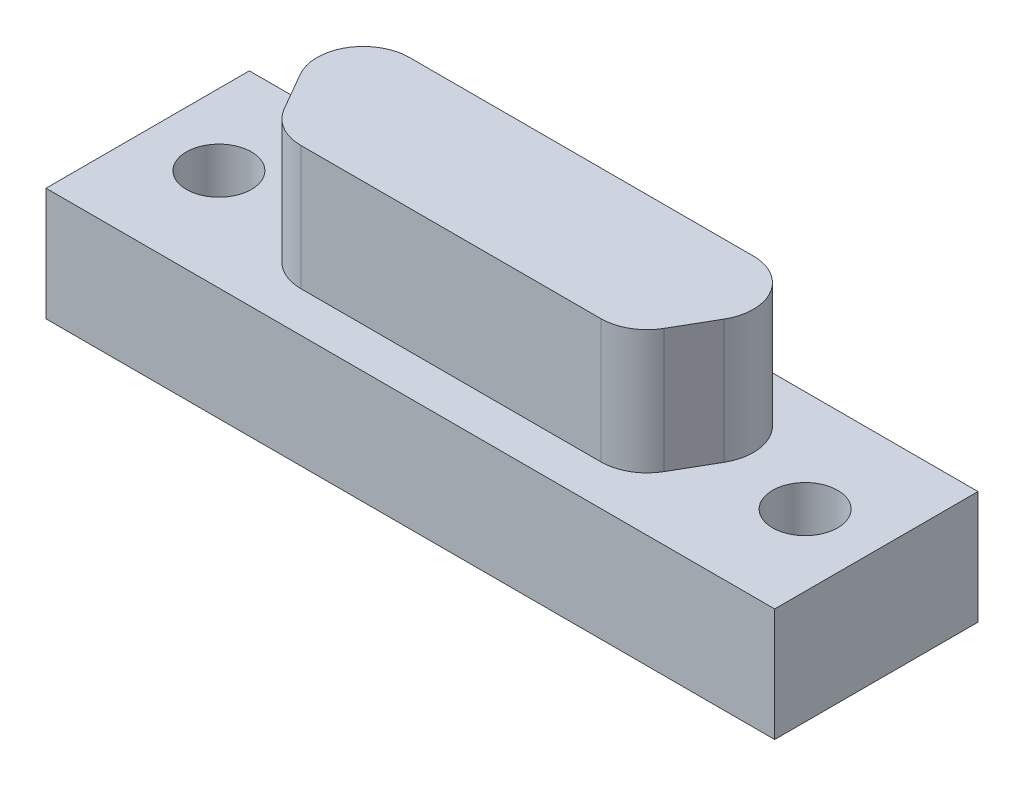
ISO-10303-21;
HEADER;
FILE_DESCRIPTION(('STEP AP214'),'2;1');
FILE_NAME('part.step','',(''),(''),'','','');
FILE_SCHEMA(('AUTOMOTIVE_DESIGN { 1 0 10303 214 1 1 1 1 }'));
ENDSEC;
DATA;
#1=APPLICATION_CONTEXT('core data for automotive mechanical design processes');
#2=APPLICATION_PROTOCOL_DEFINITION('international standard','automotive_design',2000,#1);
#3=PRODUCT_CONTEXT('',#1,'mechanical');
#4=PRODUCT('Part','Part','',(#3));
#5=PRODUCT_RELATED_PRODUCT_CATEGORY('part','',(#4));
#6=PRODUCT_DEFINITION_FORMATION('','',#4);
#7=PRODUCT_DEFINITION_CONTEXT('part definition',#1,'design');
#8=PRODUCT_DEFINITION('design','',#6,#7);
#9=PRODUCT_DEFINITION_SHAPE('','',#8);
#10=(LENGTH_UNIT() NAMED_UNIT(*) SI_UNIT(.MILLI.,.METRE.));
#11=(NAMED_UNIT(*) PLANE_ANGLE_UNIT() SI_UNIT($,.RADIAN.));
#12=(NAMED_UNIT(*) SI_UNIT($,.STERADIAN.) SOLID_ANGLE_UNIT());
#13=UNCERTAINTY_MEASURE_WITH_UNIT(LENGTH_MEASURE(1.E-05),#10,'distance_accuracy_value','');
#14=(GEOMETRIC_REPRESENTATION_CONTEXT(3) GLOBAL_UNCERTAINTY_ASSIGNED_CONTEXT((#13)) GLOBAL_UNIT_ASSIGNED_CONTEXT((#10,
#11,#12)) REPRESENTATION_CONTEXT('',''));
#15=CARTESIAN_POINT('',(0.,0.,0.));
#16=DIRECTION('',(0.,0.,1.));
#17=DIRECTION('',(1.,0.,0.));
#18=AXIS2_PLACEMENT_3D('',#15,#16,#17);
#19=CARTESIAN_POINT('',(27.31,4.24,0.));
#20=DIRECTION('',(1.,0.,0.));
#21=DIRECTION('',(0.,0.,-1.));
#22=AXIS2_PLACEMENT_3D('',#19,#20,#21);
#23=PLANE('',#22);
#24=DIRECTION('',(0.,0.,1.));
#25=VECTOR('',#24,1.);
#26=CARTESIAN_POINT('',(27.31,0.,0.));
#27=LINE('',#26,#25);
#28=CARTESIAN_POINT('',(27.31,0.,0.));
#29=VERTEX_POINT('',#28);
#30=CARTESIAN_POINT('',(27.31,0.,7.62));
#31=VERTEX_POINT('',#30);
#32=EDGE_CURVE('E122',#29,#31,#27,.T.);
#33=ORIENTED_EDGE('',*,*,#32,.F.);
#34=DIRECTION('',(0.,-1.,0.));
#35=VECTOR('',#34,1.);
#36=CARTESIAN_POINT('',(27.31,4.24,0.));
#37=LINE('',#36,#35);
#38=CARTESIAN_POINT('',(27.31,4.24,0.));
#39=VERTEX_POINT('',#38);
#40=EDGE_CURVE('E11',#39,#29,#37,.T.);
#41=ORIENTED_EDGE('',*,*,#40,.F.);
#42=DIRECTION('',(0.,0.,1.));
#43=VECTOR('',#42,1.);
#44=CARTESIAN_POINT('',(27.31,4.24,0.));
#45=LINE('',#44,#43);
#46=CARTESIAN_POINT('',(27.31,4.24,7.62));
#47=VERTEX_POINT('',#46);
#48=EDGE_CURVE('E108',#39,#47,#45,.T.);
#49=ORIENTED_EDGE('',*,*,#48,.T.);
#50=DIRECTION('',(0.,-1.,0.));
#51=VECTOR('',#50,1.);
#52=CARTESIAN_POINT('',(27.31,4.24,7.62));
#53=LINE('',#52,#51);
#54=EDGE_CURVE('E76',#47,#31,#53,.T.);
#55=ORIENTED_EDGE('',*,*,#54,.T.);
#56=EDGE_LOOP('',(#33,#41,#49,#55));
#57=FACE_BOUND('',#56,.T.);
#58=ADVANCED_FACE('F35',(#57),#23,.T.);
#59=CARTESIAN_POINT('',(0.,4.24,0.));
#60=DIRECTION('',(0.,0.,-1.));
#61=DIRECTION('',(-1.,0.,0.));
#62=AXIS2_PLACEMENT_3D('',#59,#60,#61);
#63=PLANE('',#62);
#64=DIRECTION('',(1.,0.,0.));
#65=VECTOR('',#64,1.);
#66=CARTESIAN_POINT('',(0.,0.,0.));
#67=LINE('',#66,#65);
#68=CARTESIAN_POINT('',(0.,0.,0.));
#69=VERTEX_POINT('',#68);
#70=EDGE_CURVE('E99',#69,#29,#67,.T.);
#71=ORIENTED_EDGE('',*,*,#70,.F.);
#72=DIRECTION('',(0.,-1.,0.));
#73=VECTOR('',#72,1.);
#74=CARTESIAN_POINT('',(0.,4.24,0.));
#75=LINE('',#74,#73);
#76=CARTESIAN_POINT('',(0.,4.24,0.));
#77=VERTEX_POINT('',#76);
#78=EDGE_CURVE('E44',#77,#69,#75,.T.);
#79=ORIENTED_EDGE('',*,*,#78,.F.);
#80=DIRECTION('',(1.,0.,0.));
#81=VECTOR('',#80,1.);
#82=CARTESIAN_POINT('',(0.,4.24,0.));
#83=LINE('',#82,#81);
#84=EDGE_CURVE('E97',#77,#39,#83,.T.);
#85=ORIENTED_EDGE('',*,*,#84,.T.);
#86=ORIENTED_EDGE('',*,*,#40,.T.);
#87=EDGE_LOOP('',(#71,#79,#85,#86));
#88=FACE_BOUND('',#87,.T.);
#89=ADVANCED_FACE('F95',(#88),#63,.T.);
#90=CARTESIAN_POINT('',(0.,4.24,0.));
#91=DIRECTION('',(1.,0.,0.));
#92=DIRECTION('',(0.,0.,-1.));
#93=AXIS2_PLACEMENT_3D('',#90,#91,#92);
#94=PLANE('',#93);
#95=DIRECTION('',(0.,0.,1.));
#96=VECTOR('',#95,1.);
#97=CARTESIAN_POINT('',(0.,0.,0.));
#98=LINE('',#97,#96);
#99=CARTESIAN_POINT('',(0.,0.,7.62));
#100=VERTEX_POINT('',#99);
#101=EDGE_CURVE('E125',#69,#100,#98,.T.);
#102=ORIENTED_EDGE('',*,*,#101,.T.);
#103=DIRECTION('',(0.,-1.,0.));
#104=VECTOR('',#103,1.);
#105=CARTESIAN_POINT('',(0.,4.24,7.62));
#106=LINE('',#105,#104);
#107=CARTESIAN_POINT('',(0.,4.24,7.62));
#108=VERTEX_POINT('',#107);
#109=EDGE_CURVE('E102',#108,#100,#106,.T.);
#110=ORIENTED_EDGE('',*,*,#109,.F.);
#111=DIRECTION('',(0.,0.,1.));
#112=VECTOR('',#111,1.);
#113=CARTESIAN_POINT('',(0.,4.24,0.));
#114=LINE('',#113,#112);
#115=EDGE_CURVE('E104',#77,#108,#114,.T.);
#116=ORIENTED_EDGE('',*,*,#115,.F.);
#117=ORIENTED_EDGE('',*,*,#78,.T.);
#118=EDGE_LOOP('',(#102,#110,#116,#117));
#119=FACE_BOUND('',#118,.T.);
#120=ADVANCED_FACE('F105',(#119),#94,.F.);
#121=CARTESIAN_POINT('',(2.67,4.24,3.81));
#122=DIRECTION('',(0.,-1.,0.));
#123=DIRECTION('',(0.,0.,-1.));
#124=AXIS2_PLACEMENT_3D('',#121,#122,#123);
#125=CYLINDRICAL_SURFACE('',#124,1.22);
#126=CARTESIAN_POINT('',(2.67,4.24,3.81));
#127=DIRECTION('',(0.,1.,0.));
#128=DIRECTION('',(0.,0.,1.));
#129=AXIS2_PLACEMENT_3D('',#126,#127,#128);
#130=CIRCLE('',#129,1.22);
#131=CARTESIAN_POINT('',(2.67,4.24,5.03));
#132=VERTEX_POINT('',#131);
#133=EDGE_CURVE('E110',#132,#132,#130,.T.);
#134=ORIENTED_EDGE('',*,*,#133,.T.);
#135=EDGE_LOOP('',(#134));
#136=FACE_BOUND('',#135,.T.);
#137=CARTESIAN_POINT('',(2.67,0.,3.81));
#138=DIRECTION('',(0.,1.,0.));
#139=DIRECTION('',(0.,0.,1.));
#140=AXIS2_PLACEMENT_3D('',#137,#138,#139);
#141=CIRCLE('',#140,1.22);
#142=CARTESIAN_POINT('',(2.67,0.,5.03));
#143=VERTEX_POINT('',#142);
#144=EDGE_CURVE('E118',#143,#143,#141,.T.);
#145=ORIENTED_EDGE('',*,*,#144,.F.);
#146=EDGE_LOOP('',(#145));
#147=FACE_BOUND('',#146,.T.);
#148=ADVANCED_FACE('F140',(#136,#147),#125,.F.);
#149=CARTESIAN_POINT('',(24.64,4.24,3.81));
#150=DIRECTION('',(0.,-1.,0.));
#151=DIRECTION('',(0.,0.,-1.));
#152=AXIS2_PLACEMENT_3D('',#149,#150,#151);
#153=CYLINDRICAL_SURFACE('',#152,1.22);
#154=CARTESIAN_POINT('',(24.64,4.24,3.81));
#155=DIRECTION('',(0.,1.,0.));
#156=DIRECTION('',(0.,0.,1.));
#157=AXIS2_PLACEMENT_3D('',#154,#155,#156);
#158=CIRCLE('',#157,1.22);
#159=CARTESIAN_POINT('',(24.64,4.24,5.03));
#160=VERTEX_POINT('',#159);
#161=EDGE_CURVE('E364',#160,#160,#158,.T.);
#162=ORIENTED_EDGE('',*,*,#161,.T.);
#163=EDGE_LOOP('',(#162));
#164=FACE_BOUND('',#163,.T.);
#165=CARTESIAN_POINT('',(24.64,0.,3.81));
#166=DIRECTION('',(0.,1.,0.));
#167=DIRECTION('',(0.,0.,1.));
#168=AXIS2_PLACEMENT_3D('',#165,#166,#167);
#169=CIRCLE('',#168,1.22);
#170=CARTESIAN_POINT('',(24.64,0.,5.03));
#171=VERTEX_POINT('',#170);
#172=EDGE_CURVE('E115',#171,#171,#169,.T.);
#173=ORIENTED_EDGE('',*,*,#172,.F.);
#174=EDGE_LOOP('',(#173));
#175=FACE_BOUND('',#174,.T.);
#176=ADVANCED_FACE('F37',(#164,#175),#153,.F.);
#177=CARTESIAN_POINT('',(0.,4.24,7.62));
#178=DIRECTION('',(0.,0.,-1.));
#179=DIRECTION('',(-1.,0.,0.));
#180=AXIS2_PLACEMENT_3D('',#177,#178,#179);
#181=PLANE('',#180);
#182=DIRECTION('',(1.,0.,0.));
#183=VECTOR('',#182,1.);
#184=CARTESIAN_POINT('',(0.,0.,7.62));
#185=LINE('',#184,#183);
#186=EDGE_CURVE('E69',#100,#31,#185,.T.);
#187=ORIENTED_EDGE('',*,*,#186,.T.);
#188=ORIENTED_EDGE('',*,*,#54,.F.);
#189=DIRECTION('',(1.,0.,0.));
#190=VECTOR('',#189,1.);
#191=CARTESIAN_POINT('',(0.,4.24,7.62));
#192=LINE('',#191,#190);
#193=EDGE_CURVE('E52',#108,#47,#192,.T.);
#194=ORIENTED_EDGE('',*,*,#193,.F.);
#195=ORIENTED_EDGE('',*,*,#109,.T.);
#196=EDGE_LOOP('',(#187,#188,#194,#195));
#197=FACE_BOUND('',#196,.T.);
#198=ADVANCED_FACE('F131',(#197),#181,.F.);
#199=CARTESIAN_POINT('',(0.,4.24,0.));
#200=DIRECTION('',(0.,1.,0.));
#201=DIRECTION('',(0.,0.,1.));
#202=AXIS2_PLACEMENT_3D('',#199,#200,#201);
#203=PLANE('',#202);
#204=CARTESIAN_POINT('',(20.105868875419,4.24,2.945));
#205=DIRECTION('',(0.,1.,0.));
#206=DIRECTION('',(0.,0.,1.));
#207=AXIS2_PLACEMENT_3D('',#204,#205,#206);
#208=CIRCLE('',#207,1.73);
#209=CARTESIAN_POINT('',(20.105868875419,4.24,1.215));
#210=VERTEX_POINT('',#209);
#211=CARTESIAN_POINT('',(21.6040928239661,4.24,3.81));
#212=VERTEX_POINT('',#211);
#213=EDGE_CURVE('E358',#210,#212,#208,.F.);
#214=ORIENTED_EDGE('',*,*,#213,.T.);
#215=DIRECTION('',(-0.5,0.,0.866025403784439));
#216=VECTOR('',#215,1.);
#217=CARTESIAN_POINT('',(17.8528480121839,4.24,10.3073466056359));
#218=LINE('',#217,#216);
#219=CARTESIAN_POINT('',(20.7784819390249,4.24,5.24));
#220=VERTEX_POINT('',#219);
#221=EDGE_CURVE('E361',#212,#220,#218,.T.);
#222=ORIENTED_EDGE('',*,*,#221,.T.);
#223=CARTESIAN_POINT('',(19.2802579904778,4.24,4.37499999999999));
#224=DIRECTION('',(0.,1.,0.));
#225=DIRECTION('',(0.,0.,1.));
#226=AXIS2_PLACEMENT_3D('',#223,#224,#225);
#227=CIRCLE('',#226,1.73000000000001);
#228=CARTESIAN_POINT('',(19.2802579904779,4.24,6.105));
#229=VERTEX_POINT('',#228);
#230=EDGE_CURVE('E128',#220,#229,#227,.F.);
#231=ORIENTED_EDGE('',*,*,#230,.T.);
#232=DIRECTION('',(1.,0.,0.));
#233=VECTOR('',#232,1.);
#234=CARTESIAN_POINT('',(0.,4.24,6.105));
#235=LINE('',#234,#233);
#236=CARTESIAN_POINT('',(8.0414797603602,4.24,6.105));
#237=VERTEX_POINT('',#236);
#238=EDGE_CURVE('E343',#237,#229,#235,.T.);
#239=ORIENTED_EDGE('',*,*,#238,.F.);
#240=CARTESIAN_POINT('',(8.0414797603602,4.24,4.37500000000001));
#241=DIRECTION('',(0.,1.,0.));
#242=DIRECTION('',(0.,0.,1.));
#243=AXIS2_PLACEMENT_3D('',#240,#241,#242);
#244=CIRCLE('',#243,1.72999999999999);
#245=CARTESIAN_POINT('',(6.54325581181313,4.24,5.24000000000001));
#246=VERTEX_POINT('',#245);
#247=EDGE_CURVE('E349',#237,#246,#244,.F.);
#248=ORIENTED_EDGE('',*,*,#247,.T.);
#249=DIRECTION('',(-0.5,0.,-0.866025403784439));
#250=VECTOR('',#249,1.);
#251=CARTESIAN_POINT('',(2.63845530094461,4.24,-1.52331287824517));
#252=LINE('',#251,#250);
#253=CARTESIAN_POINT('',(5.71764492687196,4.24,3.81));
#254=VERTEX_POINT('',#253);
#255=EDGE_CURVE('E352',#246,#254,#252,.T.);
#256=ORIENTED_EDGE('',*,*,#255,.T.);
#257=CARTESIAN_POINT('',(7.21586887541901,4.24,2.94500000000001));
#258=DIRECTION('',(0.,1.,0.));
#259=DIRECTION('',(0.,0.,1.));
#260=AXIS2_PLACEMENT_3D('',#257,#258,#259);
#261=CIRCLE('',#260,1.72999999999997);
#262=CARTESIAN_POINT('',(7.21586887541904,4.24,1.215));
#263=VERTEX_POINT('',#262);
#264=EDGE_CURVE('E355',#254,#263,#261,.F.);
#265=ORIENTED_EDGE('',*,*,#264,.T.);
#266=DIRECTION('',(-1.,0.,0.));
#267=VECTOR('',#266,1.);
#268=CARTESIAN_POINT('',(0.,4.24,1.215));
#269=LINE('',#268,#267);
#270=EDGE_CURVE('E119',#210,#263,#269,.T.);
#271=ORIENTED_EDGE('',*,*,#270,.F.);
#272=EDGE_LOOP('',(#214,#222,#231,#239,#248,#256,#265,#271));
#273=FACE_BOUND('',#272,.T.);
#274=ORIENTED_EDGE('',*,*,#161,.F.);
#275=EDGE_LOOP('',(#274));
#276=FACE_BOUND('',#275,.T.);
#277=ORIENTED_EDGE('',*,*,#133,.F.);
#278=EDGE_LOOP('',(#277));
#279=FACE_BOUND('',#278,.T.);
#280=ORIENTED_EDGE('',*,*,#48,.F.);
#281=ORIENTED_EDGE('',*,*,#84,.F.);
#282=ORIENTED_EDGE('',*,*,#115,.T.);
#283=ORIENTED_EDGE('',*,*,#193,.T.);
#284=EDGE_LOOP('',(#280,#281,#282,#283));
#285=FACE_BOUND('',#284,.T.);
#286=ADVANCED_FACE('F107',(#273,#276,#279,#285),#203,.T.);
#287=CARTESIAN_POINT('',(0.,0.,0.));
#288=DIRECTION('',(0.,1.,0.));
#289=DIRECTION('',(0.,0.,1.));
#290=AXIS2_PLACEMENT_3D('',#287,#288,#289);
#291=PLANE('',#290);
#292=ORIENTED_EDGE('',*,*,#172,.T.);
#293=EDGE_LOOP('',(#292));
#294=FACE_BOUND('',#293,.T.);
#295=ORIENTED_EDGE('',*,*,#144,.T.);
#296=EDGE_LOOP('',(#295));
#297=FACE_BOUND('',#296,.T.);
#298=ORIENTED_EDGE('',*,*,#32,.T.);
#299=ORIENTED_EDGE('',*,*,#186,.F.);
#300=ORIENTED_EDGE('',*,*,#101,.F.);
#301=ORIENTED_EDGE('',*,*,#70,.T.);
#302=EDGE_LOOP('',(#298,#299,#300,#301));
#303=FACE_BOUND('',#302,.T.);
#304=ADVANCED_FACE('F132',(#294,#297,#303),#291,.F.);
#305=CARTESIAN_POINT('',(20.105868875419,8.89,2.945));
#306=DIRECTION('',(0.,-1.,0.));
#307=DIRECTION('',(0.,0.,-1.));
#308=AXIS2_PLACEMENT_3D('',#305,#306,#307);
#309=CYLINDRICAL_SURFACE('',#308,1.73);
#310=DIRECTION('',(0.,-1.,0.));
#311=VECTOR('',#310,1.);
#312=CARTESIAN_POINT('',(21.6040928239661,8.89,3.81));
#313=LINE('',#312,#311);
#314=CARTESIAN_POINT('',(21.6040928239661,8.89,3.81));
#315=VERTEX_POINT('',#314);
#316=EDGE_CURVE('E326',#315,#212,#313,.T.);
#317=ORIENTED_EDGE('',*,*,#316,.T.);
#318=ORIENTED_EDGE('',*,*,#213,.F.);
#319=DIRECTION('',(0.,-1.,0.));
#320=VECTOR('',#319,1.);
#321=CARTESIAN_POINT('',(20.105868875419,8.89,1.215));
#322=LINE('',#321,#320);
#323=CARTESIAN_POINT('',(20.105868875419,8.89,1.215));
#324=VERTEX_POINT('',#323);
#325=EDGE_CURVE('E305',#324,#210,#322,.T.);
#326=ORIENTED_EDGE('',*,*,#325,.F.);
#327=CARTESIAN_POINT('',(20.105868875419,8.89,2.945));
#328=DIRECTION('',(0.,1.,0.));
#329=DIRECTION('',(0.,0.,1.));
#330=AXIS2_PLACEMENT_3D('',#327,#328,#329);
#331=CIRCLE('',#330,1.73);
#332=EDGE_CURVE('E289',#324,#315,#331,.F.);
#333=ORIENTED_EDGE('',*,*,#332,.T.);
#334=EDGE_LOOP('',(#317,#318,#326,#333));
#335=FACE_BOUND('',#334,.T.);
#336=ADVANCED_FACE('F154',(#335),#309,.T.);
#337=CARTESIAN_POINT('',(0.,8.89,1.215));
#338=DIRECTION('',(0.,0.,-1.));
#339=DIRECTION('',(-1.,0.,0.));
#340=AXIS2_PLACEMENT_3D('',#337,#338,#339);
#341=PLANE('',#340);
#342=ORIENTED_EDGE('',*,*,#325,.T.);
#343=ORIENTED_EDGE('',*,*,#270,.T.);
#344=DIRECTION('',(0.,-1.,0.));
#345=VECTOR('',#344,1.);
#346=CARTESIAN_POINT('',(7.21586887541904,8.89,1.215));
#347=LINE('',#346,#345);
#348=CARTESIAN_POINT('',(7.21586887541904,8.89,1.215));
#349=VERTEX_POINT('',#348);
#350=EDGE_CURVE('E308',#349,#263,#347,.T.);
#351=ORIENTED_EDGE('',*,*,#350,.F.);
#352=DIRECTION('',(1.,0.,0.));
#353=VECTOR('',#352,1.);
#354=CARTESIAN_POINT('',(0.,8.89,1.215));
#355=LINE('',#354,#353);
#356=EDGE_CURVE('E293',#349,#324,#355,.T.);
#357=ORIENTED_EDGE('',*,*,#356,.T.);
#358=EDGE_LOOP('',(#342,#343,#351,#357));
#359=FACE_BOUND('',#358,.T.);
#360=ADVANCED_FACE('F161',(#359),#341,.T.);
#361=CARTESIAN_POINT('',(7.21586887541904,8.89,2.94500000000001));
#362=DIRECTION('',(0.,-1.,0.));
#363=DIRECTION('',(0.,0.,-1.));
#364=AXIS2_PLACEMENT_3D('',#361,#362,#363);
#365=CYLINDRICAL_SURFACE('',#364,1.73);
#366=ORIENTED_EDGE('',*,*,#350,.T.);
#367=ORIENTED_EDGE('',*,*,#264,.F.);
#368=DIRECTION('',(0.,-1.,0.));
#369=VECTOR('',#368,1.);
#370=CARTESIAN_POINT('',(5.71764492687196,8.89,3.81));
#371=LINE('',#370,#369);
#372=CARTESIAN_POINT('',(5.71764492687196,8.89,3.81));
#373=VERTEX_POINT('',#372);
#374=EDGE_CURVE('E338',#373,#254,#371,.T.);
#375=ORIENTED_EDGE('',*,*,#374,.F.);
#376=CARTESIAN_POINT('',(7.21586887541904,8.89,2.94500000000001));
#377=DIRECTION('',(0.,1.,0.));
#378=DIRECTION('',(0.,0.,1.));
#379=AXIS2_PLACEMENT_3D('',#376,#377,#378);
#380=CIRCLE('',#379,1.73);
#381=EDGE_CURVE('E309',#373,#349,#380,.F.);
#382=ORIENTED_EDGE('',*,*,#381,.T.);
#383=EDGE_LOOP('',(#366,#367,#375,#382));
#384=FACE_BOUND('',#383,.T.);
#385=ADVANCED_FACE('F198',(#384),#365,.T.);
#386=CARTESIAN_POINT('',(2.63845530094461,8.89,-1.52331287824517));
#387=DIRECTION('',(-0.866025403784439,0.,0.5));
#388=DIRECTION('',(0.5,0.,0.866025403784439));
#389=AXIS2_PLACEMENT_3D('',#386,#387,#388);
#390=PLANE('',#389);
#391=ORIENTED_EDGE('',*,*,#374,.T.);
#392=ORIENTED_EDGE('',*,*,#255,.F.);
#393=DIRECTION('',(0.,-1.,0.));
#394=VECTOR('',#393,1.);
#395=CARTESIAN_POINT('',(6.54325581181313,8.89,5.24000000000001));
#396=LINE('',#395,#394);
#397=CARTESIAN_POINT('',(6.54325581181313,8.89,5.24000000000001));
#398=VERTEX_POINT('',#397);
#399=EDGE_CURVE('E335',#398,#246,#396,.T.);
#400=ORIENTED_EDGE('',*,*,#399,.F.);
#401=DIRECTION('',(-0.5,0.,-0.866025403784439));
#402=VECTOR('',#401,1.);
#403=CARTESIAN_POINT('',(2.63845530094461,8.89,-1.52331287824517));
#404=LINE('',#403,#402);
#405=EDGE_CURVE('E311',#398,#373,#404,.T.);
#406=ORIENTED_EDGE('',*,*,#405,.T.);
#407=EDGE_LOOP('',(#391,#392,#400,#406));
#408=FACE_BOUND('',#407,.T.);
#409=ADVANCED_FACE('F209',(#408),#390,.T.);
#410=CARTESIAN_POINT('',(8.0414797603602,8.89,4.37500000000001));
#411=DIRECTION('',(0.,-1.,0.));
#412=DIRECTION('',(0.,0.,-1.));
#413=AXIS2_PLACEMENT_3D('',#410,#411,#412);
#414=CYLINDRICAL_SURFACE('',#413,1.72999999999999);
#415=ORIENTED_EDGE('',*,*,#399,.T.);
#416=ORIENTED_EDGE('',*,*,#247,.F.);
#417=DIRECTION('',(0.,-1.,0.));
#418=VECTOR('',#417,1.);
#419=CARTESIAN_POINT('',(8.0414797603602,8.89,6.105));
#420=LINE('',#419,#418);
#421=CARTESIAN_POINT('',(8.0414797603602,8.89,6.105));
#422=VERTEX_POINT('',#421);
#423=EDGE_CURVE('E332',#422,#237,#420,.T.);
#424=ORIENTED_EDGE('',*,*,#423,.F.);
#425=CARTESIAN_POINT('',(8.0414797603602,8.89,4.37500000000001));
#426=DIRECTION('',(0.,1.,0.));
#427=DIRECTION('',(0.,0.,1.));
#428=AXIS2_PLACEMENT_3D('',#425,#426,#427);
#429=CIRCLE('',#428,1.72999999999999);
#430=EDGE_CURVE('E316',#422,#398,#429,.F.);
#431=ORIENTED_EDGE('',*,*,#430,.T.);
#432=EDGE_LOOP('',(#415,#416,#424,#431));
#433=FACE_BOUND('',#432,.T.);
#434=ADVANCED_FACE('F219',(#433),#414,.T.);
#435=CARTESIAN_POINT('',(0.,8.89,6.105));
#436=DIRECTION('',(0.,0.,1.));
#437=DIRECTION('',(1.,0.,0.));
#438=AXIS2_PLACEMENT_3D('',#435,#436,#437);
#439=PLANE('',#438);
#440=ORIENTED_EDGE('',*,*,#423,.T.);
#441=ORIENTED_EDGE('',*,*,#238,.T.);
#442=DIRECTION('',(0.,-1.,0.));
#443=VECTOR('',#442,1.);
#444=CARTESIAN_POINT('',(19.2802579904779,8.89,6.105));
#445=LINE('',#444,#443);
#446=CARTESIAN_POINT('',(19.2802579904779,8.89,6.105));
#447=VERTEX_POINT('',#446);
#448=EDGE_CURVE('E329',#447,#229,#445,.T.);
#449=ORIENTED_EDGE('',*,*,#448,.F.);
#450=DIRECTION('',(-1.,0.,0.));
#451=VECTOR('',#450,1.);
#452=CARTESIAN_POINT('',(0.,8.89,6.105));
#453=LINE('',#452,#451);
#454=EDGE_CURVE('E319',#447,#422,#453,.T.);
#455=ORIENTED_EDGE('',*,*,#454,.T.);
#456=EDGE_LOOP('',(#440,#441,#449,#455));
#457=FACE_BOUND('',#456,.T.);
#458=ADVANCED_FACE('F229',(#457),#439,.T.);
#459=CARTESIAN_POINT('',(19.2802579904778,8.89,4.37499999999999));
#460=DIRECTION('',(0.,-1.,0.));
#461=DIRECTION('',(0.,0.,-1.));
#462=AXIS2_PLACEMENT_3D('',#459,#460,#461);
#463=CYLINDRICAL_SURFACE('',#462,1.73000000000001);
#464=ORIENTED_EDGE('',*,*,#448,.T.);
#465=ORIENTED_EDGE('',*,*,#230,.F.);
#466=DIRECTION('',(0.,-1.,0.));
#467=VECTOR('',#466,1.);
#468=CARTESIAN_POINT('',(20.7784819390249,8.89,5.24));
#469=LINE('',#468,#467);
#470=CARTESIAN_POINT('',(20.7784819390249,8.89,5.24));
#471=VERTEX_POINT('',#470);
#472=EDGE_CURVE('E84',#471,#220,#469,.T.);
#473=ORIENTED_EDGE('',*,*,#472,.F.);
#474=CARTESIAN_POINT('',(19.2802579904778,8.89,4.37499999999999));
#475=DIRECTION('',(0.,1.,0.));
#476=DIRECTION('',(0.,0.,1.));
#477=AXIS2_PLACEMENT_3D('',#474,#475,#476);
#478=CIRCLE('',#477,1.73000000000001);
#479=EDGE_CURVE('E322',#471,#447,#478,.F.);
#480=ORIENTED_EDGE('',*,*,#479,.T.);
#481=EDGE_LOOP('',(#464,#465,#473,#480));
#482=FACE_BOUND('',#481,.T.);
#483=ADVANCED_FACE('F239',(#482),#463,.T.);
#484=CARTESIAN_POINT('',(17.8528480121839,8.89,10.3073466056359));
#485=DIRECTION('',(0.866025403784439,0.,0.5));
#486=DIRECTION('',(0.5,0.,-0.866025403784439));
#487=AXIS2_PLACEMENT_3D('',#484,#485,#486);
#488=PLANE('',#487);
#489=ORIENTED_EDGE('',*,*,#472,.T.);
#490=ORIENTED_EDGE('',*,*,#221,.F.);
#491=ORIENTED_EDGE('',*,*,#316,.F.);
#492=DIRECTION('',(-0.5,0.,0.866025403784439));
#493=VECTOR('',#492,1.);
#494=CARTESIAN_POINT('',(17.8528480121839,8.89,10.3073466056359));
#495=LINE('',#494,#493);
#496=EDGE_CURVE('E297',#315,#471,#495,.T.);
#497=ORIENTED_EDGE('',*,*,#496,.T.);
#498=EDGE_LOOP('',(#489,#490,#491,#497));
#499=FACE_BOUND('',#498,.T.);
#500=ADVANCED_FACE('F249',(#499),#488,.T.);
#501=CARTESIAN_POINT('',(0.,8.89,0.));
#502=DIRECTION('',(0.,1.,0.));
#503=DIRECTION('',(0.,0.,1.));
#504=AXIS2_PLACEMENT_3D('',#501,#502,#503);
#505=PLANE('',#504);
#506=ORIENTED_EDGE('',*,*,#332,.F.);
#507=ORIENTED_EDGE('',*,*,#356,.F.);
#508=ORIENTED_EDGE('',*,*,#381,.F.);
#509=ORIENTED_EDGE('',*,*,#405,.F.);
#510=ORIENTED_EDGE('',*,*,#430,.F.);
#511=ORIENTED_EDGE('',*,*,#454,.F.);
#512=ORIENTED_EDGE('',*,*,#479,.F.);
#513=ORIENTED_EDGE('',*,*,#496,.F.);
#514=EDGE_LOOP('',(#506,#507,#508,#509,#510,#511,#512,#513));
#515=FACE_BOUND('',#514,.T.);
#516=ADVANCED_FACE('F259',(#515),#505,.T.);
#517=CLOSED_SHELL('',(#58,#89,#120,#148,#176,#198,#286,#304,#336,#360,#385,#409,#434,#458,#483,
#500,#516));
#518=MANIFOLD_SOLID_BREP('B2',#517);
#519=ADVANCED_BREP_SHAPE_REPRESENTATION('',(#18,#518),#14);
#520=SHAPE_DEFINITION_REPRESENTATION(#9,#519);
ENDSEC;
END-ISO-10303-21;
